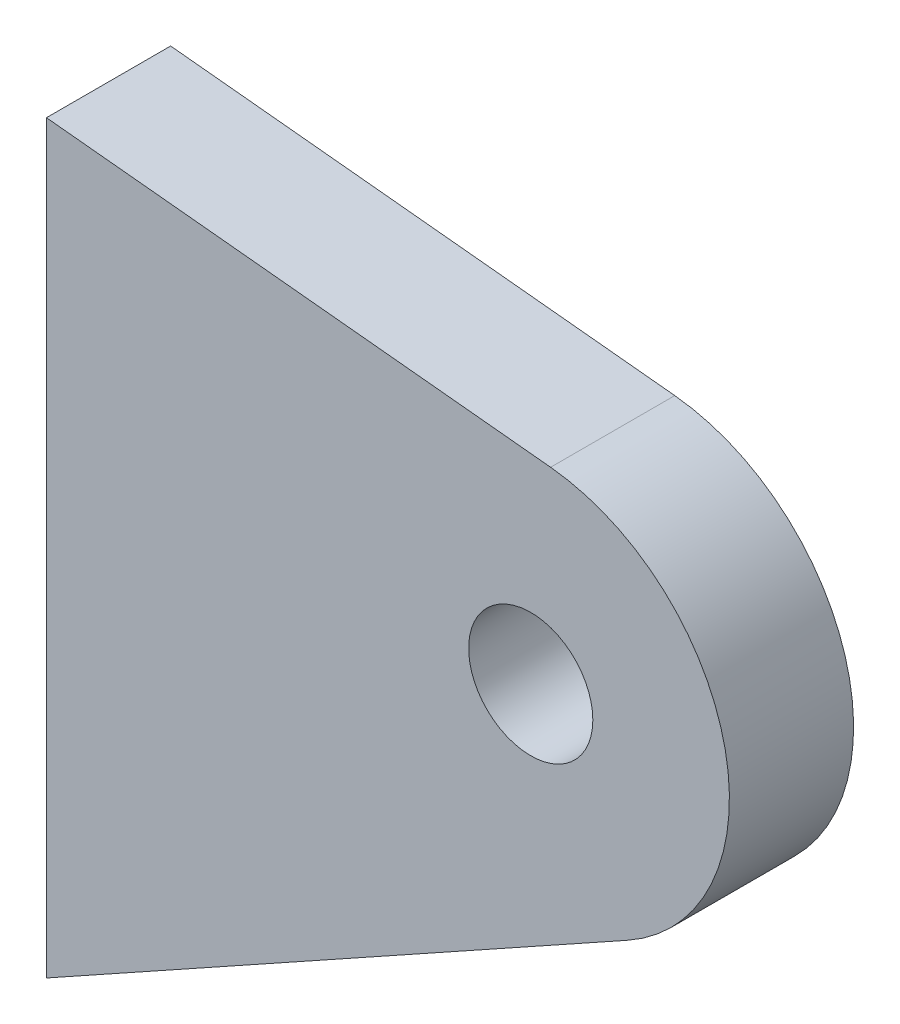
ISO-10303-21;
HEADER;
FILE_DESCRIPTION(('STEP AP214'),'2;1');
FILE_NAME('part.step','',(''),(''),'','','');
FILE_SCHEMA(('AUTOMOTIVE_DESIGN { 1 0 10303 214 1 1 1 1 }'));
ENDSEC;
DATA;
#1=APPLICATION_CONTEXT('core data for automotive mechanical design processes');
#2=APPLICATION_PROTOCOL_DEFINITION('international standard','automotive_design',2000,#1);
#3=PRODUCT_CONTEXT('',#1,'mechanical');
#4=PRODUCT('Part','Part','',(#3));
#5=PRODUCT_RELATED_PRODUCT_CATEGORY('part','',(#4));
#6=PRODUCT_DEFINITION_FORMATION('','',#4);
#7=PRODUCT_DEFINITION_CONTEXT('part definition',#1,'design');
#8=PRODUCT_DEFINITION('design','',#6,#7);
#9=PRODUCT_DEFINITION_SHAPE('','',#8);
#10=(LENGTH_UNIT() NAMED_UNIT(*) SI_UNIT(.MILLI.,.METRE.));
#11=(NAMED_UNIT(*) PLANE_ANGLE_UNIT() SI_UNIT($,.RADIAN.));
#12=(NAMED_UNIT(*) SI_UNIT($,.STERADIAN.) SOLID_ANGLE_UNIT());
#13=UNCERTAINTY_MEASURE_WITH_UNIT(LENGTH_MEASURE(1.E-05),#10,'distance_accuracy_value','');
#14=(GEOMETRIC_REPRESENTATION_CONTEXT(3) GLOBAL_UNCERTAINTY_ASSIGNED_CONTEXT((#13)) GLOBAL_UNIT_ASSIGNED_CONTEXT((#10,
#11,#12)) REPRESENTATION_CONTEXT('',''));
#15=CARTESIAN_POINT('',(0.,0.,0.));
#16=DIRECTION('',(0.,0.,1.));
#17=DIRECTION('',(1.,0.,0.));
#18=AXIS2_PLACEMENT_3D('',#15,#16,#17);
#19=CARTESIAN_POINT('',(0.,0.,5.));
#20=DIRECTION('',(0.,0.,1.));
#21=DIRECTION('',(1.,0.,0.));
#22=AXIS2_PLACEMENT_3D('',#19,#20,#21);
#23=PLANE('',#22);
#24=DIRECTION('',(0.873919287346149,0.486071063944768,0.));
#25=VECTOR('',#24,1.);
#26=CARTESIAN_POINT('',(-19.5,-20.,5.));
#27=LINE('',#26,#25);
#28=CARTESIAN_POINT('',(-19.5,-20.,5.));
#29=VERTEX_POINT('',#28);
#30=CARTESIAN_POINT('',(3.88856851155817,-6.99135429876917,5.));
#31=VERTEX_POINT('',#30);
#32=EDGE_CURVE('E121',#29,#31,#27,.T.);
#33=ORIENTED_EDGE('',*,*,#32,.T.);
#34=CARTESIAN_POINT('',(0.,0.,5.));
#35=DIRECTION('',(0.,0.,1.));
#36=DIRECTION('',(1.,0.,0.));
#37=AXIS2_PLACEMENT_3D('',#34,#35,#36);
#38=CIRCLE('',#37,7.99999999999999);
#39=CARTESIAN_POINT('',(0.799950986045324,7.95990442278835,5.));
#40=VERTEX_POINT('',#39);
#41=EDGE_CURVE('E89',#31,#40,#38,.T.);
#42=ORIENTED_EDGE('',*,*,#41,.T.);
#43=DIRECTION('',(-0.994988052848541,0.0999938732556618,0.));
#44=VECTOR('',#43,1.);
#45=CARTESIAN_POINT('',(0.799950986045324,7.95990442278835,5.));
#46=LINE('',#45,#44);
#47=CARTESIAN_POINT('',(-19.5,10.,5.));
#48=VERTEX_POINT('',#47);
#49=EDGE_CURVE('E124',#40,#48,#46,.T.);
#50=ORIENTED_EDGE('',*,*,#49,.T.);
#51=DIRECTION('',(0.,-1.,0.));
#52=VECTOR('',#51,1.);
#53=CARTESIAN_POINT('',(-19.5,10.,5.));
#54=LINE('',#53,#52);
#55=EDGE_CURVE('E60',#48,#29,#54,.T.);
#56=ORIENTED_EDGE('',*,*,#55,.T.);
#57=EDGE_LOOP('',(#33,#42,#50,#56));
#58=FACE_BOUND('',#57,.T.);
#59=CARTESIAN_POINT('',(0.,0.,5.));
#60=DIRECTION('',(0.,0.,1.));
#61=DIRECTION('',(1.,0.,0.));
#62=AXIS2_PLACEMENT_3D('',#59,#60,#61);
#63=CIRCLE('',#62,2.5);
#64=CARTESIAN_POINT('',(2.50000000000003,0.,5.));
#65=VERTEX_POINT('',#64);
#66=EDGE_CURVE('E115',#65,#65,#63,.T.);
#67=ORIENTED_EDGE('',*,*,#66,.F.);
#68=EDGE_LOOP('',(#67));
#69=FACE_BOUND('',#68,.T.);
#70=ADVANCED_FACE('F32',(#58,#69),#23,.T.);
#71=CARTESIAN_POINT('',(0.,0.,0.));
#72=DIRECTION('',(0.,0.,1.));
#73=DIRECTION('',(1.,0.,0.));
#74=AXIS2_PLACEMENT_3D('',#71,#72,#73);
#75=PLANE('',#74);
#76=DIRECTION('',(0.873919287346149,0.486071063944768,0.));
#77=VECTOR('',#76,1.);
#78=CARTESIAN_POINT('',(-19.5,-20.,0.));
#79=LINE('',#78,#77);
#80=CARTESIAN_POINT('',(-19.5,-20.,0.));
#81=VERTEX_POINT('',#80);
#82=CARTESIAN_POINT('',(3.88856851155817,-6.99135429876917,0.));
#83=VERTEX_POINT('',#82);
#84=EDGE_CURVE('E118',#81,#83,#79,.T.);
#85=ORIENTED_EDGE('',*,*,#84,.F.);
#86=DIRECTION('',(0.,-1.,0.));
#87=VECTOR('',#86,1.);
#88=CARTESIAN_POINT('',(-19.5,10.,0.));
#89=LINE('',#88,#87);
#90=CARTESIAN_POINT('',(-19.5,10.,0.));
#91=VERTEX_POINT('',#90);
#92=EDGE_CURVE('E81',#91,#81,#89,.T.);
#93=ORIENTED_EDGE('',*,*,#92,.F.);
#94=DIRECTION('',(-0.994988052848541,0.0999938732556618,0.));
#95=VECTOR('',#94,1.);
#96=CARTESIAN_POINT('',(0.799950986045324,7.95990442278835,0.));
#97=LINE('',#96,#95);
#98=CARTESIAN_POINT('',(0.799950986045324,7.95990442278835,0.));
#99=VERTEX_POINT('',#98);
#100=EDGE_CURVE('E132',#99,#91,#97,.T.);
#101=ORIENTED_EDGE('',*,*,#100,.F.);
#102=CARTESIAN_POINT('',(0.,0.,0.));
#103=DIRECTION('',(0.,0.,1.));
#104=DIRECTION('',(1.,0.,0.));
#105=AXIS2_PLACEMENT_3D('',#102,#103,#104);
#106=CIRCLE('',#105,7.99999999999999);
#107=EDGE_CURVE('E130',#83,#99,#106,.T.);
#108=ORIENTED_EDGE('',*,*,#107,.F.);
#109=EDGE_LOOP('',(#85,#93,#101,#108));
#110=FACE_BOUND('',#109,.T.);
#111=CARTESIAN_POINT('',(0.,0.,0.));
#112=DIRECTION('',(0.,0.,1.));
#113=DIRECTION('',(1.,0.,0.));
#114=AXIS2_PLACEMENT_3D('',#111,#112,#113);
#115=CIRCLE('',#114,2.5);
#116=CARTESIAN_POINT('',(2.50000000000003,0.,0.));
#117=VERTEX_POINT('',#116);
#118=EDGE_CURVE('E114',#117,#117,#115,.T.);
#119=ORIENTED_EDGE('',*,*,#118,.T.);
#120=EDGE_LOOP('',(#119));
#121=FACE_BOUND('',#120,.T.);
#122=ADVANCED_FACE('F160',(#110,#121),#75,.F.);
#123=CARTESIAN_POINT('',(-19.5,-20.,5.));
#124=DIRECTION('',(-0.486071063944768,0.873919287346149,0.));
#125=DIRECTION('',(-0.873919287346149,-0.486071063944768,0.));
#126=AXIS2_PLACEMENT_3D('',#123,#124,#125);
#127=PLANE('',#126);
#128=CARTESIAN_POINT('',(-12.3083002493237,-16.0000000000023,2.50000000000013));
#129=DIRECTION('',(-0.486071063944768,0.873919287346149,0.));
#130=DIRECTION('',(-0.873919287346149,-0.486071063944768,0.));
#131=AXIS2_PLACEMENT_3D('',#128,#129,#130);
#132=ELLIPSE('',#131,2.57164043021912,1.24999999999999);
#133=CARTESIAN_POINT('',(-10.4,-14.9386096108148,1.83973456720791));
#134=VERTEX_POINT('',#133);
#135=CARTESIAN_POINT('',(-10.4,-14.9386096108148,3.16026543279235));
#136=VERTEX_POINT('',#135);
#137=EDGE_CURVE('E45',#134,#136,#132,.T.);
#138=ORIENTED_EDGE('',*,*,#137,.T.);
#139=CARTESIAN_POINT('',(-10.4002,-14.938720850164,3.1610739872759));
#140=CARTESIAN_POINT('',(-10.3865373088262,-14.9311217057906,3.10591443878176));
#141=CARTESIAN_POINT('',(-10.3742295070949,-14.9242761465165,3.0502800756321));
#142=CARTESIAN_POINT('',(-10.3527627220888,-14.9123363905477,2.93814873537689));
#143=CARTESIAN_POINT('',(-10.3436079695371,-14.9072445469674,2.8816507046868));
#144=CARTESIAN_POINT('',(-10.3290824102215,-14.8991654781412,2.76924334658033));
#145=CARTESIAN_POINT('',(-10.3236348067685,-14.8961355388269,2.7133473016343));
#146=CARTESIAN_POINT('',(-10.316510635359,-14.8921730978705,2.60127423584968));
#147=CARTESIAN_POINT('',(-10.3148315414661,-14.8912391913109,2.54509742852574));
#148=CARTESIAN_POINT('',(-10.3153279856919,-14.8915153119739,2.43457197038326));
#149=CARTESIAN_POINT('',(-10.3173814753069,-14.8926574562159,2.38022254223826));
#150=CARTESIAN_POINT('',(-10.3249949145206,-14.8968920263328,2.27181667796029));
#151=CARTESIAN_POINT('',(-10.330557016214,-14.899985649196,2.21776044220393));
#152=CARTESIAN_POINT('',(-10.3450621660622,-14.9080533663427,2.1090851363061));
#153=CARTESIAN_POINT('',(-10.3540743300136,-14.9130659026075,2.05447839590362));
#154=CARTESIAN_POINT('',(-10.3750380951318,-14.9247258805515,1.94607654681285));
#155=CARTESIAN_POINT('',(-10.3869859680079,-14.9313712485676,1.89228049982108));
#156=CARTESIAN_POINT('',(-10.4002,-14.938720850164,1.8389260127244));
#157=B_SPLINE_CURVE_WITH_KNOTS('',3,(#139,#140,#141,#142,#143,#144,#145,#146,#147,#148,#149,
#150,#151,#152,#153,#154,#155,#156),.UNSPECIFIED.,.F.,.F.,(4,2,2,2,2,2,2,2,4),(0.,
0.172025774533769,0.34428148004072,0.512850265496047,0.681306029785549,0.844352342146538,
1.00749876041132,1.17410074779135,1.34049223781967),.UNSPECIFIED.);
#158=EDGE_CURVE('E11',#136,#134,#157,.T.);
#159=ORIENTED_EDGE('',*,*,#158,.T.);
#160=EDGE_LOOP('',(#138,#159));
#161=FACE_BOUND('',#160,.T.);
#162=ORIENTED_EDGE('',*,*,#84,.T.);
#163=DIRECTION('',(0.,0.,-1.));
#164=VECTOR('',#163,1.);
#165=CARTESIAN_POINT('',(3.88856851155817,-6.99135429876917,5.));
#166=LINE('',#165,#164);
#167=EDGE_CURVE('E141',#31,#83,#166,.T.);
#168=ORIENTED_EDGE('',*,*,#167,.F.);
#169=ORIENTED_EDGE('',*,*,#32,.F.);
#170=DIRECTION('',(0.,0.,-1.));
#171=VECTOR('',#170,1.);
#172=CARTESIAN_POINT('',(-19.5,-20.,5.));
#173=LINE('',#172,#171);
#174=EDGE_CURVE('E127',#29,#81,#173,.T.);
#175=ORIENTED_EDGE('',*,*,#174,.T.);
#176=EDGE_LOOP('',(#162,#168,#169,#175));
#177=FACE_BOUND('',#176,.T.);
#178=ADVANCED_FACE('F34',(#161,#177),#127,.F.);
#179=CARTESIAN_POINT('',(0.,0.,5.));
#180=DIRECTION('',(0.,0.,-1.));
#181=DIRECTION('',(-1.,0.,0.));
#182=AXIS2_PLACEMENT_3D('',#179,#180,#181);
#183=CYLINDRICAL_SURFACE('',#182,7.99999999999999);
#184=ORIENTED_EDGE('',*,*,#107,.T.);
#185=DIRECTION('',(0.,0.,-1.));
#186=VECTOR('',#185,1.);
#187=CARTESIAN_POINT('',(0.799950986045324,7.95990442278835,5.));
#188=LINE('',#187,#186);
#189=EDGE_CURVE('E138',#40,#99,#188,.T.);
#190=ORIENTED_EDGE('',*,*,#189,.F.);
#191=ORIENTED_EDGE('',*,*,#41,.F.);
#192=ORIENTED_EDGE('',*,*,#167,.T.);
#193=EDGE_LOOP('',(#184,#190,#191,#192));
#194=FACE_BOUND('',#193,.T.);
#195=ADVANCED_FACE('F174',(#194),#183,.T.);
#196=CARTESIAN_POINT('',(0.799950986045324,7.95990442278835,5.));
#197=DIRECTION('',(-0.0999938732556618,-0.994988052848541,0.));
#198=DIRECTION('',(0.994988052848541,-0.0999938732556618,0.));
#199=AXIS2_PLACEMENT_3D('',#196,#197,#198);
#200=PLANE('',#199);
#201=ORIENTED_EDGE('',*,*,#100,.T.);
#202=DIRECTION('',(0.,0.,-1.));
#203=VECTOR('',#202,1.);
#204=CARTESIAN_POINT('',(-19.5,10.,5.));
#205=LINE('',#204,#203);
#206=EDGE_CURVE('E136',#48,#91,#205,.T.);
#207=ORIENTED_EDGE('',*,*,#206,.F.);
#208=ORIENTED_EDGE('',*,*,#49,.F.);
#209=ORIENTED_EDGE('',*,*,#189,.T.);
#210=EDGE_LOOP('',(#201,#207,#208,#209));
#211=FACE_BOUND('',#210,.T.);
#212=ADVANCED_FACE('F171',(#211),#200,.F.);
#213=CARTESIAN_POINT('',(-19.5,10.,5.));
#214=DIRECTION('',(1.,0.,0.));
#215=DIRECTION('',(0.,0.,-1.));
#216=AXIS2_PLACEMENT_3D('',#213,#214,#215);
#217=PLANE('',#216);
#218=CARTESIAN_POINT('',(-19.5,5.99999999999768,2.50000000000015));
#219=DIRECTION('',(-1.,0.,0.));
#220=DIRECTION('',(0.,0.,1.));
#221=AXIS2_PLACEMENT_3D('',#218,#219,#220);
#222=CIRCLE('',#221,1.24999999999999);
#223=CARTESIAN_POINT('',(-19.5,5.99999999999768,3.75000000000014));
#224=VERTEX_POINT('',#223);
#225=EDGE_CURVE('E106',#224,#224,#222,.T.);
#226=ORIENTED_EDGE('',*,*,#225,.F.);
#227=EDGE_LOOP('',(#226));
#228=FACE_BOUND('',#227,.T.);
#229=CARTESIAN_POINT('',(-19.5,-16.0000000000023,2.50000000000013));
#230=DIRECTION('',(-1.,0.,0.));
#231=DIRECTION('',(0.,0.,1.));
#232=AXIS2_PLACEMENT_3D('',#229,#230,#231);
#233=CIRCLE('',#232,1.24999999999999);
#234=CARTESIAN_POINT('',(-19.5,-16.0000000000023,3.75000000000012));
#235=VERTEX_POINT('',#234);
#236=EDGE_CURVE('E105',#235,#235,#233,.T.);
#237=ORIENTED_EDGE('',*,*,#236,.F.);
#238=EDGE_LOOP('',(#237));
#239=FACE_BOUND('',#238,.T.);
#240=ORIENTED_EDGE('',*,*,#92,.T.);
#241=ORIENTED_EDGE('',*,*,#174,.F.);
#242=ORIENTED_EDGE('',*,*,#55,.F.);
#243=ORIENTED_EDGE('',*,*,#206,.T.);
#244=EDGE_LOOP('',(#240,#241,#242,#243));
#245=FACE_BOUND('',#244,.T.);
#246=ADVANCED_FACE('F155',(#228,#239,#245),#217,.F.);
#247=CARTESIAN_POINT('',(0.,0.,5.));
#248=DIRECTION('',(0.,0.,-1.));
#249=DIRECTION('',(-1.,0.,0.));
#250=AXIS2_PLACEMENT_3D('',#247,#248,#249);
#251=CYLINDRICAL_SURFACE('',#250,2.5);
#252=ORIENTED_EDGE('',*,*,#66,.T.);
#253=EDGE_LOOP('',(#252));
#254=FACE_BOUND('',#253,.T.);
#255=ORIENTED_EDGE('',*,*,#118,.F.);
#256=EDGE_LOOP('',(#255));
#257=FACE_BOUND('',#256,.T.);
#258=ADVANCED_FACE('F148',(#254,#257),#251,.F.);
#259=CARTESIAN_POINT('',(-10.4,-16.0000000000023,2.50000000000013));
#260=DIRECTION('',(-1.,0.,0.));
#261=DIRECTION('',(0.,0.,1.));
#262=AXIS2_PLACEMENT_3D('',#259,#260,#261);
#263=CONICAL_SURFACE('',#262,1.24999999999999,1.02974425867665);
#264=CARTESIAN_POINT('',(-10.4,-16.0000000000023,2.50000000000013));
#265=DIRECTION('',(-1.,0.,0.));
#266=DIRECTION('',(0.,0.,1.));
#267=AXIS2_PLACEMENT_3D('',#264,#265,#266);
#268=CIRCLE('',#267,1.24999999999999);
#269=EDGE_CURVE('E51',#136,#134,#268,.T.);
#270=ORIENTED_EDGE('',*,*,#269,.T.);
#271=ORIENTED_EDGE('',*,*,#158,.F.);
#272=EDGE_LOOP('',(#270,#271));
#273=FACE_BOUND('',#272,.T.);
#274=ADVANCED_FACE('F146',(#273),#263,.F.);
#275=CARTESIAN_POINT('',(-19.5,-16.0000000000023,2.50000000000013));
#276=DIRECTION('',(-1.,0.,0.));
#277=DIRECTION('',(0.,0.,1.));
#278=AXIS2_PLACEMENT_3D('',#275,#276,#277);
#279=CYLINDRICAL_SURFACE('',#278,1.24999999999999);
#280=ORIENTED_EDGE('',*,*,#236,.T.);
#281=EDGE_LOOP('',(#280));
#282=FACE_BOUND('',#281,.T.);
#283=ORIENTED_EDGE('',*,*,#269,.F.);
#284=ORIENTED_EDGE('',*,*,#137,.F.);
#285=EDGE_LOOP('',(#283,#284));
#286=FACE_BOUND('',#285,.T.);
#287=ADVANCED_FACE('F99',(#282,#286),#279,.F.);
#288=CARTESIAN_POINT('',(-10.4,5.99999999999768,2.50000000000015));
#289=DIRECTION('',(-1.,0.,0.));
#290=DIRECTION('',(0.,0.,1.));
#291=AXIS2_PLACEMENT_3D('',#288,#289,#290);
#292=CONICAL_SURFACE('',#291,1.24999999999999,1.02974425867665);
#293=CARTESIAN_POINT('',(-9.64892422621553,5.99999999999767,2.50000000000015));
#294=VERTEX_POINT('',#293);
#295=VERTEX_LOOP('',#294);
#296=FACE_BOUND('',#295,.T.);
#297=CARTESIAN_POINT('',(-10.4,5.99999999999768,2.50000000000015));
#298=DIRECTION('',(-1.,0.,0.));
#299=DIRECTION('',(0.,0.,1.));
#300=AXIS2_PLACEMENT_3D('',#297,#298,#299);
#301=CIRCLE('',#300,1.24999999999999);
#302=CARTESIAN_POINT('',(-10.4,5.99999999999768,3.75000000000014));
#303=VERTEX_POINT('',#302);
#304=EDGE_CURVE('E103',#303,#303,#301,.T.);
#305=ORIENTED_EDGE('',*,*,#304,.T.);
#306=EDGE_LOOP('',(#305));
#307=FACE_BOUND('',#306,.T.);
#308=ADVANCED_FACE('F95',(#296,#307),#292,.F.);
#309=CARTESIAN_POINT('',(-19.5,5.99999999999768,2.50000000000015));
#310=DIRECTION('',(-1.,0.,0.));
#311=DIRECTION('',(0.,0.,1.));
#312=AXIS2_PLACEMENT_3D('',#309,#310,#311);
#313=CYLINDRICAL_SURFACE('',#312,1.24999999999999);
#314=ORIENTED_EDGE('',*,*,#304,.F.);
#315=EDGE_LOOP('',(#314));
#316=FACE_BOUND('',#315,.T.);
#317=ORIENTED_EDGE('',*,*,#225,.T.);
#318=EDGE_LOOP('',(#317));
#319=FACE_BOUND('',#318,.T.);
#320=ADVANCED_FACE('F98',(#316,#319),#313,.F.);
#321=CLOSED_SHELL('',(#70,#122,#178,#195,#212,#246,#258,#274,#287,#308,#320));
#322=MANIFOLD_SOLID_BREP('B2',#321);
#323=ADVANCED_BREP_SHAPE_REPRESENTATION('',(#18,#322),#14);
#324=SHAPE_DEFINITION_REPRESENTATION(#9,#323);
ENDSEC;
END-ISO-10303-21;
